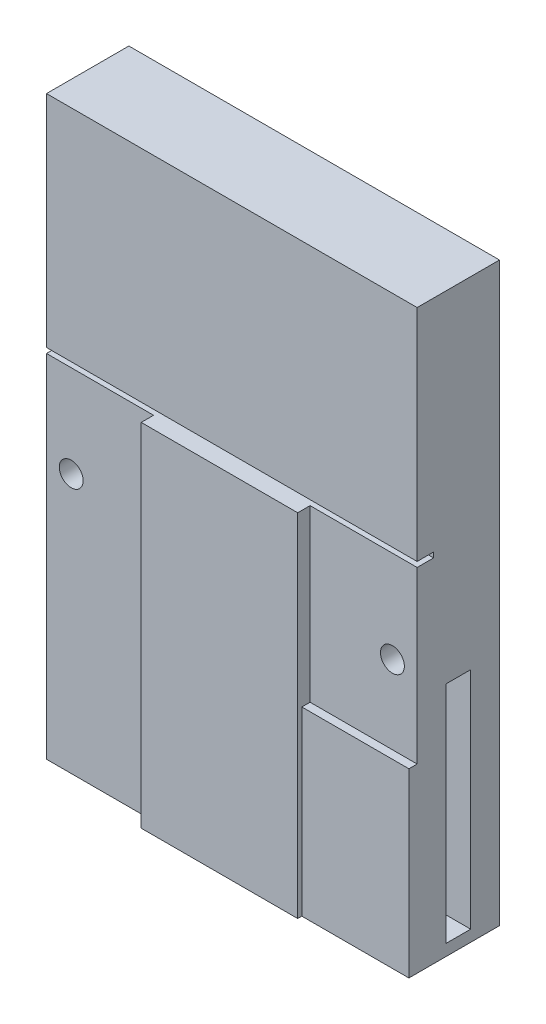
ISO-10303-21;
HEADER;
FILE_DESCRIPTION(('STEP AP214'),'2;1');
FILE_NAME('part.step','',(''),(''),'','','');
FILE_SCHEMA(('AUTOMOTIVE_DESIGN { 1 0 10303 214 1 1 1 1 }'));
ENDSEC;
DATA;
#1=APPLICATION_CONTEXT('core data for automotive mechanical design processes');
#2=APPLICATION_PROTOCOL_DEFINITION('international standard','automotive_design',2000,#1);
#3=PRODUCT_CONTEXT('',#1,'mechanical');
#4=PRODUCT('Part','Part','',(#3));
#5=PRODUCT_RELATED_PRODUCT_CATEGORY('part','',(#4));
#6=PRODUCT_DEFINITION_FORMATION('','',#4);
#7=PRODUCT_DEFINITION_CONTEXT('part definition',#1,'design');
#8=PRODUCT_DEFINITION('design','',#6,#7);
#9=PRODUCT_DEFINITION_SHAPE('','',#8);
#10=(LENGTH_UNIT() NAMED_UNIT(*) SI_UNIT(.MILLI.,.METRE.));
#11=(NAMED_UNIT(*) PLANE_ANGLE_UNIT() SI_UNIT($,.RADIAN.));
#12=(NAMED_UNIT(*) SI_UNIT($,.STERADIAN.) SOLID_ANGLE_UNIT());
#13=UNCERTAINTY_MEASURE_WITH_UNIT(LENGTH_MEASURE(1.E-05),#10,'distance_accuracy_value','');
#14=(GEOMETRIC_REPRESENTATION_CONTEXT(3) GLOBAL_UNCERTAINTY_ASSIGNED_CONTEXT((#13)) GLOBAL_UNIT_ASSIGNED_CONTEXT((#10,
#11,#12)) REPRESENTATION_CONTEXT('',''));
#15=CARTESIAN_POINT('',(0.,0.,0.));
#16=DIRECTION('',(0.,0.,1.));
#17=DIRECTION('',(1.,0.,0.));
#18=AXIS2_PLACEMENT_3D('',#15,#16,#17);
#19=CARTESIAN_POINT('',(22.5,40.,5.));
#20=DIRECTION('',(0.,0.,-1.));
#21=DIRECTION('',(-1.,0.,0.));
#22=AXIS2_PLACEMENT_3D('',#19,#20,#21);
#23=PLANE('',#22);
#24=CARTESIAN_POINT('',(19.5,11.5,5.));
#25=DIRECTION('',(0.,0.,1.));
#26=DIRECTION('',(1.,0.,0.));
#27=AXIS2_PLACEMENT_3D('',#24,#25,#26);
#28=CIRCLE('',#27,1.45);
#29=CARTESIAN_POINT('',(20.95,11.5,5.));
#30=VERTEX_POINT('',#29);
#31=EDGE_CURVE('E229',#30,#30,#28,.T.);
#32=ORIENTED_EDGE('',*,*,#31,.F.);
#33=EDGE_LOOP('',(#32));
#34=FACE_BOUND('',#33,.T.);
#35=DIRECTION('',(-1.,0.,0.));
#36=VECTOR('',#35,1.);
#37=CARTESIAN_POINT('',(9.5,2.,5.));
#38=LINE('',#37,#36);
#39=CARTESIAN_POINT('',(22.5,2.,5.));
#40=VERTEX_POINT('',#39);
#41=CARTESIAN_POINT('',(9.5,2.,5.));
#42=VERTEX_POINT('',#41);
#43=EDGE_CURVE('E188',#40,#42,#38,.T.);
#44=ORIENTED_EDGE('',*,*,#43,.F.);
#45=DIRECTION('',(0.,-1.,0.));
#46=VECTOR('',#45,1.);
#47=CARTESIAN_POINT('',(22.5,40.,5.));
#48=LINE('',#47,#46);
#49=CARTESIAN_POINT('',(22.5,22.6713275749144,5.));
#50=VERTEX_POINT('',#49);
#51=EDGE_CURVE('E258',#50,#40,#48,.T.);
#52=ORIENTED_EDGE('',*,*,#51,.F.);
#53=DIRECTION('',(1.,0.,0.));
#54=VECTOR('',#53,1.);
#55=CARTESIAN_POINT('',(-22.5,22.6713275749144,5.));
#56=LINE('',#55,#54);
#57=CARTESIAN_POINT('',(9.49999999999998,22.6713275749144,5.));
#58=VERTEX_POINT('',#57);
#59=EDGE_CURVE('E196',#58,#50,#56,.T.);
#60=ORIENTED_EDGE('',*,*,#59,.F.);
#61=DIRECTION('',(0.,1.,0.));
#62=VECTOR('',#61,1.);
#63=CARTESIAN_POINT('',(9.49999999999999,22.6713275749144,5.));
#64=LINE('',#63,#62);
#65=EDGE_CURVE('E316',#42,#58,#64,.T.);
#66=ORIENTED_EDGE('',*,*,#65,.F.);
#67=EDGE_LOOP('',(#44,#52,#60,#66));
#68=FACE_BOUND('',#67,.T.);
#69=ADVANCED_FACE('F41',(#34,#68),#23,.F.);
#70=CARTESIAN_POINT('',(9.49999999999999,22.6713275749144,6.5));
#71=DIRECTION('',(-1.,0.,0.));
#72=DIRECTION('',(0.,-1.,0.));
#73=AXIS2_PLACEMENT_3D('',#70,#71,#72);
#74=PLANE('',#73);
#75=DIRECTION('',(0.,0.,-1.));
#76=VECTOR('',#75,1.);
#77=CARTESIAN_POINT('',(9.5,2.,6.));
#78=LINE('',#77,#76);
#79=CARTESIAN_POINT('',(9.49999999999999,2.,6.));
#80=VERTEX_POINT('',#79);
#81=EDGE_CURVE('E58',#80,#42,#78,.T.);
#82=ORIENTED_EDGE('',*,*,#81,.T.);
#83=ORIENTED_EDGE('',*,*,#65,.T.);
#84=DIRECTION('',(0.,0.,-1.));
#85=VECTOR('',#84,1.);
#86=CARTESIAN_POINT('',(9.49999999999999,22.6713275749144,6.5));
#87=LINE('',#86,#85);
#88=CARTESIAN_POINT('',(9.49999999999999,22.6713275749144,6.5));
#89=VERTEX_POINT('',#88);
#90=EDGE_CURVE('E194',#89,#58,#87,.T.);
#91=ORIENTED_EDGE('',*,*,#90,.F.);
#92=DIRECTION('',(0.,1.,0.));
#93=VECTOR('',#92,1.);
#94=CARTESIAN_POINT('',(9.49999999999999,22.6713275749144,6.5));
#95=LINE('',#94,#93);
#96=CARTESIAN_POINT('',(9.5,-20.,6.5));
#97=VERTEX_POINT('',#96);
#98=EDGE_CURVE('E192',#97,#89,#95,.T.);
#99=ORIENTED_EDGE('',*,*,#98,.F.);
#100=DIRECTION('',(0.,0.,-1.));
#101=VECTOR('',#100,1.);
#102=CARTESIAN_POINT('',(9.5,-20.,6.5));
#103=LINE('',#102,#101);
#104=CARTESIAN_POINT('',(9.49999999999999,-20.,6.));
#105=VERTEX_POINT('',#104);
#106=EDGE_CURVE('E174',#97,#105,#103,.T.);
#107=ORIENTED_EDGE('',*,*,#106,.T.);
#108=DIRECTION('',(0.,-1.,0.));
#109=VECTOR('',#108,1.);
#110=CARTESIAN_POINT('',(9.5,2.,6.));
#111=LINE('',#110,#109);
#112=EDGE_CURVE('E182',#80,#105,#111,.T.);
#113=ORIENTED_EDGE('',*,*,#112,.F.);
#114=EDGE_LOOP('',(#82,#83,#91,#99,#107,#113));
#115=FACE_BOUND('',#114,.T.);
#116=ADVANCED_FACE('F190',(#115),#74,.F.);
#117=CARTESIAN_POINT('',(-19.5,11.5,5.));
#118=DIRECTION('',(0.,0.,1.));
#119=DIRECTION('',(1.,0.,0.));
#120=AXIS2_PLACEMENT_3D('',#117,#118,#119);
#121=CIRCLE('',#120,1.45);
#122=CARTESIAN_POINT('',(-18.05,11.5,5.));
#123=VERTEX_POINT('',#122);
#124=EDGE_CURVE('E222',#123,#123,#121,.T.);
#125=ORIENTED_EDGE('',*,*,#124,.F.);
#126=EDGE_LOOP('',(#125));
#127=FACE_BOUND('',#126,.T.);
#128=DIRECTION('',(0.,-1.,0.));
#129=VECTOR('',#128,1.);
#130=CARTESIAN_POINT('',(-9.50000000000001,22.6713275749144,5.));
#131=LINE('',#130,#129);
#132=CARTESIAN_POINT('',(-9.50000000000001,22.6713275749144,5.));
#133=VERTEX_POINT('',#132);
#134=CARTESIAN_POINT('',(-9.5,-20.,5.));
#135=VERTEX_POINT('',#134);
#136=EDGE_CURVE('E311',#133,#135,#131,.T.);
#137=ORIENTED_EDGE('',*,*,#136,.F.);
#138=CARTESIAN_POINT('',(-22.5,22.6713275749144,5.));
#139=VERTEX_POINT('',#138);
#140=EDGE_CURVE('E215',#139,#133,#56,.T.);
#141=ORIENTED_EDGE('',*,*,#140,.F.);
#142=DIRECTION('',(0.,-1.,0.));
#143=VECTOR('',#142,1.);
#144=CARTESIAN_POINT('',(-22.5,40.,5.00000000000001));
#145=LINE('',#144,#143);
#146=CARTESIAN_POINT('',(-22.5,-20.,5.00000000000001));
#147=VERTEX_POINT('',#146);
#148=EDGE_CURVE('E50',#139,#147,#145,.T.);
#149=ORIENTED_EDGE('',*,*,#148,.T.);
#150=DIRECTION('',(-1.,0.,0.));
#151=VECTOR('',#150,1.);
#152=CARTESIAN_POINT('',(-22.5,-20.,5.00000000000001));
#153=LINE('',#152,#151);
#154=EDGE_CURVE('E240',#135,#147,#153,.T.);
#155=ORIENTED_EDGE('',*,*,#154,.F.);
#156=EDGE_LOOP('',(#137,#141,#149,#155));
#157=FACE_BOUND('',#156,.T.);
#158=ADVANCED_FACE('F289',(#127,#157),#23,.F.);
#159=CARTESIAN_POINT('',(-22.5,50.,5.));
#160=VERTEX_POINT('',#159);
#161=CARTESIAN_POINT('',(-22.5,23.2974929319475,5.));
#162=VERTEX_POINT('',#161);
#163=EDGE_CURVE('E11',#160,#162,#145,.T.);
#164=ORIENTED_EDGE('',*,*,#163,.T.);
#165=DIRECTION('',(-1.,0.,0.));
#166=VECTOR('',#165,1.);
#167=CARTESIAN_POINT('',(-22.5,23.2974929319475,5.));
#168=LINE('',#167,#166);
#169=CARTESIAN_POINT('',(22.5,23.2974929319475,5.));
#170=VERTEX_POINT('',#169);
#171=EDGE_CURVE('E207',#170,#162,#168,.T.);
#172=ORIENTED_EDGE('',*,*,#171,.F.);
#173=CARTESIAN_POINT('',(22.5,50.,5.));
#174=VERTEX_POINT('',#173);
#175=EDGE_CURVE('E259',#174,#170,#48,.T.);
#176=ORIENTED_EDGE('',*,*,#175,.F.);
#177=DIRECTION('',(1.,0.,0.));
#178=VECTOR('',#177,1.);
#179=CARTESIAN_POINT('',(-22.5,50.,5.));
#180=LINE('',#179,#178);
#181=EDGE_CURVE('E245',#160,#174,#180,.T.);
#182=ORIENTED_EDGE('',*,*,#181,.F.);
#183=EDGE_LOOP('',(#164,#172,#176,#182));
#184=FACE_BOUND('',#183,.T.);
#185=ADVANCED_FACE('F288',(#184),#23,.F.);
#186=CARTESIAN_POINT('',(-22.5,40.,-4.99999999999999));
#187=DIRECTION('',(1.,0.,0.));
#188=DIRECTION('',(0.,0.,-1.));
#189=AXIS2_PLACEMENT_3D('',#186,#187,#188);
#190=PLANE('',#189);
#191=DIRECTION('',(0.,-1.,0.));
#192=VECTOR('',#191,1.);
#193=CARTESIAN_POINT('',(-22.5,23.2974929319475,3.));
#194=LINE('',#193,#192);
#195=CARTESIAN_POINT('',(-22.5,23.2974929319475,3.));
#196=VERTEX_POINT('',#195);
#197=CARTESIAN_POINT('',(-22.5,22.6713275749144,3.));
#198=VERTEX_POINT('',#197);
#199=EDGE_CURVE('E203',#196,#198,#194,.T.);
#200=ORIENTED_EDGE('',*,*,#199,.F.);
#201=DIRECTION('',(0.,0.,1.));
#202=VECTOR('',#201,1.);
#203=CARTESIAN_POINT('',(-22.5,23.2974929319475,3.));
#204=LINE('',#203,#202);
#205=EDGE_CURVE('E219',#196,#162,#204,.T.);
#206=ORIENTED_EDGE('',*,*,#205,.T.);
#207=ORIENTED_EDGE('',*,*,#163,.F.);
#208=DIRECTION('',(0.,0.,1.));
#209=VECTOR('',#208,1.);
#210=CARTESIAN_POINT('',(-22.5,50.,-4.99999999999999));
#211=LINE('',#210,#209);
#212=CARTESIAN_POINT('',(-22.5,50.,-4.99999999999999));
#213=VERTEX_POINT('',#212);
#214=EDGE_CURVE('E242',#213,#160,#211,.T.);
#215=ORIENTED_EDGE('',*,*,#214,.F.);
#216=DIRECTION('',(0.,-1.,0.));
#217=VECTOR('',#216,1.);
#218=CARTESIAN_POINT('',(-22.5,40.,-4.99999999999999));
#219=LINE('',#218,#217);
#220=CARTESIAN_POINT('',(-22.5,-20.,-5.));
#221=VERTEX_POINT('',#220);
#222=EDGE_CURVE('E254',#213,#221,#219,.T.);
#223=ORIENTED_EDGE('',*,*,#222,.T.);
#224=DIRECTION('',(0.,0.,-1.));
#225=VECTOR('',#224,1.);
#226=CARTESIAN_POINT('',(-22.5,-20.,5.00000000000001));
#227=LINE('',#226,#225);
#228=EDGE_CURVE('E235',#147,#221,#227,.T.);
#229=ORIENTED_EDGE('',*,*,#228,.F.);
#230=ORIENTED_EDGE('',*,*,#148,.F.);
#231=DIRECTION('',(0.,0.,1.));
#232=VECTOR('',#231,1.);
#233=CARTESIAN_POINT('',(-22.5,22.6713275749144,3.));
#234=LINE('',#233,#232);
#235=EDGE_CURVE('E214',#198,#139,#234,.T.);
#236=ORIENTED_EDGE('',*,*,#235,.F.);
#237=EDGE_LOOP('',(#200,#206,#207,#215,#223,#229,#230,#236));
#238=FACE_BOUND('',#237,.T.);
#239=ADVANCED_FACE('F43',(#238),#190,.F.);
#240=CARTESIAN_POINT('',(22.5,40.,-5.));
#241=DIRECTION('',(-1.,0.,0.));
#242=DIRECTION('',(0.,0.,1.));
#243=AXIS2_PLACEMENT_3D('',#240,#241,#242);
#244=PLANE('',#243);
#245=DIRECTION('',(0.,0.,-1.));
#246=VECTOR('',#245,1.);
#247=CARTESIAN_POINT('',(22.5,-18.6150080325972,1.5));
#248=LINE('',#247,#246);
#249=CARTESIAN_POINT('',(22.5,-18.6150080325973,1.5));
#250=VERTEX_POINT('',#249);
#251=CARTESIAN_POINT('',(22.5,-18.6150080325972,-1.5));
#252=VERTEX_POINT('',#251);
#253=EDGE_CURVE('E386',#250,#252,#248,.T.);
#254=ORIENTED_EDGE('',*,*,#253,.F.);
#255=DIRECTION('',(0.,-1.,0.));
#256=VECTOR('',#255,1.);
#257=CARTESIAN_POINT('',(22.5,8.67132757491439,1.5));
#258=LINE('',#257,#256);
#259=CARTESIAN_POINT('',(22.5,8.67132757491439,1.5));
#260=VERTEX_POINT('',#259);
#261=EDGE_CURVE('E66',#260,#250,#258,.T.);
#262=ORIENTED_EDGE('',*,*,#261,.F.);
#263=DIRECTION('',(0.,0.,1.));
#264=VECTOR('',#263,1.);
#265=CARTESIAN_POINT('',(22.5,8.67132757491439,1.5));
#266=LINE('',#265,#264);
#267=CARTESIAN_POINT('',(22.5,8.67132757491439,-1.5));
#268=VERTEX_POINT('',#267);
#269=EDGE_CURVE('E376',#268,#260,#266,.T.);
#270=ORIENTED_EDGE('',*,*,#269,.F.);
#271=DIRECTION('',(0.,1.,0.));
#272=VECTOR('',#271,1.);
#273=CARTESIAN_POINT('',(22.5,8.67132757491439,-1.5));
#274=LINE('',#273,#272);
#275=EDGE_CURVE('E389',#252,#268,#274,.T.);
#276=ORIENTED_EDGE('',*,*,#275,.F.);
#277=EDGE_LOOP('',(#254,#262,#270,#276));
#278=FACE_BOUND('',#277,.T.);
#279=ORIENTED_EDGE('',*,*,#175,.T.);
#280=DIRECTION('',(0.,0.,1.));
#281=VECTOR('',#280,1.);
#282=CARTESIAN_POINT('',(22.5,23.2974929319475,3.));
#283=LINE('',#282,#281);
#284=CARTESIAN_POINT('',(22.5,23.2974929319475,3.));
#285=VERTEX_POINT('',#284);
#286=EDGE_CURVE('E223',#285,#170,#283,.T.);
#287=ORIENTED_EDGE('',*,*,#286,.F.);
#288=DIRECTION('',(0.,1.,0.));
#289=VECTOR('',#288,1.);
#290=CARTESIAN_POINT('',(22.5,23.2974929319475,3.));
#291=LINE('',#290,#289);
#292=CARTESIAN_POINT('',(22.5,22.6713275749144,3.));
#293=VERTEX_POINT('',#292);
#294=EDGE_CURVE('E209',#293,#285,#291,.T.);
#295=ORIENTED_EDGE('',*,*,#294,.F.);
#296=DIRECTION('',(0.,0.,1.));
#297=VECTOR('',#296,1.);
#298=CARTESIAN_POINT('',(22.5,22.6713275749144,3.));
#299=LINE('',#298,#297);
#300=EDGE_CURVE('E225',#293,#50,#299,.T.);
#301=ORIENTED_EDGE('',*,*,#300,.T.);
#302=ORIENTED_EDGE('',*,*,#51,.T.);
#303=DIRECTION('',(0.,0.,-1.));
#304=VECTOR('',#303,1.);
#305=CARTESIAN_POINT('',(22.5,2.,6.));
#306=LINE('',#305,#304);
#307=CARTESIAN_POINT('',(22.5,2.,6.));
#308=VERTEX_POINT('',#307);
#309=EDGE_CURVE('E353',#308,#40,#306,.T.);
#310=ORIENTED_EDGE('',*,*,#309,.F.);
#311=DIRECTION('',(0.,1.,0.));
#312=VECTOR('',#311,1.);
#313=CARTESIAN_POINT('',(22.5,2.,6.));
#314=LINE('',#313,#312);
#315=CARTESIAN_POINT('',(22.5,-20.,6.));
#316=VERTEX_POINT('',#315);
#317=EDGE_CURVE('E181',#316,#308,#314,.T.);
#318=ORIENTED_EDGE('',*,*,#317,.F.);
#319=DIRECTION('',(0.,0.,1.));
#320=VECTOR('',#319,1.);
#321=CARTESIAN_POINT('',(22.5,-20.,5.00000000000001));
#322=LINE('',#321,#320);
#323=CARTESIAN_POINT('',(22.5,-20.,-5.));
#324=VERTEX_POINT('',#323);
#325=EDGE_CURVE('E178',#324,#316,#322,.T.);
#326=ORIENTED_EDGE('',*,*,#325,.F.);
#327=DIRECTION('',(0.,-1.,0.));
#328=VECTOR('',#327,1.);
#329=CARTESIAN_POINT('',(22.5,40.,-5.));
#330=LINE('',#329,#328);
#331=CARTESIAN_POINT('',(22.5,50.,-4.99999999999999));
#332=VERTEX_POINT('',#331);
#333=EDGE_CURVE('E256',#332,#324,#330,.T.);
#334=ORIENTED_EDGE('',*,*,#333,.F.);
#335=DIRECTION('',(0.,0.,-1.));
#336=VECTOR('',#335,1.);
#337=CARTESIAN_POINT('',(22.5,50.,-4.99999999999999));
#338=LINE('',#337,#336);
#339=EDGE_CURVE('E248',#174,#332,#338,.T.);
#340=ORIENTED_EDGE('',*,*,#339,.F.);
#341=EDGE_LOOP('',(#279,#287,#295,#301,#302,#310,#318,#326,#334,#340));
#342=FACE_BOUND('',#341,.T.);
#343=ADVANCED_FACE('F352',(#278,#342),#244,.F.);
#344=CARTESIAN_POINT('',(22.5,40.,-5.));
#345=DIRECTION('',(0.,0.,1.));
#346=DIRECTION('',(1.,0.,0.));
#347=AXIS2_PLACEMENT_3D('',#344,#345,#346);
#348=PLANE('',#347);
#349=CARTESIAN_POINT('',(19.5,11.5,-5.));
#350=DIRECTION('',(0.,0.,1.));
#351=DIRECTION('',(1.,0.,0.));
#352=AXIS2_PLACEMENT_3D('',#349,#350,#351);
#353=CIRCLE('',#352,1.45);
#354=CARTESIAN_POINT('',(20.95,11.5,-5.));
#355=VERTEX_POINT('',#354);
#356=EDGE_CURVE('E45',#355,#355,#353,.T.);
#357=ORIENTED_EDGE('',*,*,#356,.T.);
#358=EDGE_LOOP('',(#357));
#359=FACE_BOUND('',#358,.T.);
#360=CARTESIAN_POINT('',(-19.5,11.5,-4.99999999999999));
#361=DIRECTION('',(0.,0.,1.));
#362=DIRECTION('',(1.,0.,0.));
#363=AXIS2_PLACEMENT_3D('',#360,#361,#362);
#364=CIRCLE('',#363,1.45);
#365=CARTESIAN_POINT('',(-18.05,11.5,-4.99999999999999));
#366=VERTEX_POINT('',#365);
#367=EDGE_CURVE('E232',#366,#366,#364,.T.);
#368=ORIENTED_EDGE('',*,*,#367,.T.);
#369=EDGE_LOOP('',(#368));
#370=FACE_BOUND('',#369,.T.);
#371=ORIENTED_EDGE('',*,*,#333,.T.);
#372=DIRECTION('',(1.,0.,0.));
#373=VECTOR('',#372,1.);
#374=CARTESIAN_POINT('',(-22.5,-20.,-5.));
#375=LINE('',#374,#373);
#376=EDGE_CURVE('E237',#221,#324,#375,.T.);
#377=ORIENTED_EDGE('',*,*,#376,.F.);
#378=ORIENTED_EDGE('',*,*,#222,.F.);
#379=DIRECTION('',(-1.,0.,0.));
#380=VECTOR('',#379,1.);
#381=CARTESIAN_POINT('',(-22.5,50.,-4.99999999999999));
#382=LINE('',#381,#380);
#383=EDGE_CURVE('E251',#332,#213,#382,.T.);
#384=ORIENTED_EDGE('',*,*,#383,.F.);
#385=EDGE_LOOP('',(#371,#377,#378,#384));
#386=FACE_BOUND('',#385,.T.);
#387=ADVANCED_FACE('F267',(#359,#370,#386),#348,.F.);
#388=CARTESIAN_POINT('',(0.,50.,0.));
#389=DIRECTION('',(0.,1.,0.));
#390=DIRECTION('',(0.,0.,1.));
#391=AXIS2_PLACEMENT_3D('',#388,#389,#390);
#392=PLANE('',#391);
#393=ORIENTED_EDGE('',*,*,#214,.T.);
#394=ORIENTED_EDGE('',*,*,#181,.T.);
#395=ORIENTED_EDGE('',*,*,#339,.T.);
#396=ORIENTED_EDGE('',*,*,#383,.T.);
#397=EDGE_LOOP('',(#393,#394,#395,#396));
#398=FACE_BOUND('',#397,.T.);
#399=ADVANCED_FACE('F363',(#398),#392,.T.);
#400=CARTESIAN_POINT('',(0.,-20.,0.));
#401=DIRECTION('',(0.,-1.,0.));
#402=DIRECTION('',(0.,0.,-1.));
#403=AXIS2_PLACEMENT_3D('',#400,#401,#402);
#404=PLANE('',#403);
#405=ORIENTED_EDGE('',*,*,#228,.T.);
#406=ORIENTED_EDGE('',*,*,#376,.T.);
#407=ORIENTED_EDGE('',*,*,#325,.T.);
#408=DIRECTION('',(1.,0.,0.));
#409=VECTOR('',#408,1.);
#410=CARTESIAN_POINT('',(9.49999999999999,-20.,6.));
#411=LINE('',#410,#409);
#412=EDGE_CURVE('E169',#105,#316,#411,.T.);
#413=ORIENTED_EDGE('',*,*,#412,.F.);
#414=ORIENTED_EDGE('',*,*,#106,.F.);
#415=DIRECTION('',(1.,0.,0.));
#416=VECTOR('',#415,1.);
#417=CARTESIAN_POINT('',(-9.5,-20.,6.5));
#418=LINE('',#417,#416);
#419=CARTESIAN_POINT('',(-9.5,-20.,6.5));
#420=VERTEX_POINT('',#419);
#421=EDGE_CURVE('E330',#420,#97,#418,.T.);
#422=ORIENTED_EDGE('',*,*,#421,.F.);
#423=DIRECTION('',(0.,0.,-1.));
#424=VECTOR('',#423,1.);
#425=CARTESIAN_POINT('',(-9.5,-20.,6.5));
#426=LINE('',#425,#424);
#427=EDGE_CURVE('E193',#420,#135,#426,.T.);
#428=ORIENTED_EDGE('',*,*,#427,.T.);
#429=ORIENTED_EDGE('',*,*,#154,.T.);
#430=EDGE_LOOP('',(#405,#406,#407,#413,#414,#422,#428,#429));
#431=FACE_BOUND('',#430,.T.);
#432=ADVANCED_FACE('F172',(#431),#404,.T.);
#433=CARTESIAN_POINT('',(-19.5,11.5,-15.));
#434=DIRECTION('',(0.,0.,1.));
#435=DIRECTION('',(1.,0.,0.));
#436=AXIS2_PLACEMENT_3D('',#433,#434,#435);
#437=CYLINDRICAL_SURFACE('',#436,1.45);
#438=ORIENTED_EDGE('',*,*,#124,.T.);
#439=EDGE_LOOP('',(#438));
#440=FACE_BOUND('',#439,.T.);
#441=ORIENTED_EDGE('',*,*,#367,.F.);
#442=EDGE_LOOP('',(#441));
#443=FACE_BOUND('',#442,.T.);
#444=ADVANCED_FACE('F272',(#440,#443),#437,.F.);
#445=CARTESIAN_POINT('',(19.5,11.5,-15.));
#446=DIRECTION('',(0.,0.,1.));
#447=DIRECTION('',(1.,0.,0.));
#448=AXIS2_PLACEMENT_3D('',#445,#446,#447);
#449=CYLINDRICAL_SURFACE('',#448,1.45);
#450=ORIENTED_EDGE('',*,*,#31,.T.);
#451=EDGE_LOOP('',(#450));
#452=FACE_BOUND('',#451,.T.);
#453=ORIENTED_EDGE('',*,*,#356,.F.);
#454=EDGE_LOOP('',(#453));
#455=FACE_BOUND('',#454,.T.);
#456=ADVANCED_FACE('F269',(#452,#455),#449,.F.);
#457=CARTESIAN_POINT('',(-22.5,23.2974929319475,3.));
#458=DIRECTION('',(0.,1.,0.));
#459=DIRECTION('',(0.,0.,1.));
#460=AXIS2_PLACEMENT_3D('',#457,#458,#459);
#461=PLANE('',#460);
#462=ORIENTED_EDGE('',*,*,#171,.T.);
#463=ORIENTED_EDGE('',*,*,#205,.F.);
#464=DIRECTION('',(-1.,0.,0.));
#465=VECTOR('',#464,1.);
#466=CARTESIAN_POINT('',(-22.5,23.2974929319475,3.));
#467=LINE('',#466,#465);
#468=EDGE_CURVE('E211',#285,#196,#467,.T.);
#469=ORIENTED_EDGE('',*,*,#468,.F.);
#470=ORIENTED_EDGE('',*,*,#286,.T.);
#471=EDGE_LOOP('',(#462,#463,#469,#470));
#472=FACE_BOUND('',#471,.T.);
#473=ADVANCED_FACE('F271',(#472),#461,.F.);
#474=CARTESIAN_POINT('',(-22.5,22.6713275749144,3.));
#475=DIRECTION('',(0.,-1.,0.));
#476=DIRECTION('',(0.,0.,-1.));
#477=AXIS2_PLACEMENT_3D('',#474,#475,#476);
#478=PLANE('',#477);
#479=ORIENTED_EDGE('',*,*,#140,.T.);
#480=DIRECTION('',(0.,0.,-1.));
#481=VECTOR('',#480,1.);
#482=CARTESIAN_POINT('',(-9.50000000000001,22.6713275749144,6.5));
#483=LINE('',#482,#481);
#484=CARTESIAN_POINT('',(-9.50000000000001,22.6713275749144,6.5));
#485=VERTEX_POINT('',#484);
#486=EDGE_CURVE('E199',#485,#133,#483,.T.);
#487=ORIENTED_EDGE('',*,*,#486,.F.);
#488=DIRECTION('',(-1.,0.,0.));
#489=VECTOR('',#488,1.);
#490=CARTESIAN_POINT('',(-9.50000000000001,22.6713275749144,6.5));
#491=LINE('',#490,#489);
#492=EDGE_CURVE('E343',#89,#485,#491,.T.);
#493=ORIENTED_EDGE('',*,*,#492,.F.);
#494=ORIENTED_EDGE('',*,*,#90,.T.);
#495=ORIENTED_EDGE('',*,*,#59,.T.);
#496=ORIENTED_EDGE('',*,*,#300,.F.);
#497=DIRECTION('',(1.,0.,0.));
#498=VECTOR('',#497,1.);
#499=CARTESIAN_POINT('',(-22.5,22.6713275749144,3.));
#500=LINE('',#499,#498);
#501=EDGE_CURVE('E206',#198,#293,#500,.T.);
#502=ORIENTED_EDGE('',*,*,#501,.F.);
#503=ORIENTED_EDGE('',*,*,#235,.T.);
#504=EDGE_LOOP('',(#479,#487,#493,#494,#495,#496,#502,#503));
#505=FACE_BOUND('',#504,.T.);
#506=ADVANCED_FACE('F280',(#505),#478,.F.);
#507=CARTESIAN_POINT('',(0.,0.,3.));
#508=DIRECTION('',(0.,0.,1.));
#509=DIRECTION('',(1.,0.,0.));
#510=AXIS2_PLACEMENT_3D('',#507,#508,#509);
#511=PLANE('',#510);
#512=ORIENTED_EDGE('',*,*,#199,.T.);
#513=ORIENTED_EDGE('',*,*,#501,.T.);
#514=ORIENTED_EDGE('',*,*,#294,.T.);
#515=ORIENTED_EDGE('',*,*,#468,.T.);
#516=EDGE_LOOP('',(#512,#513,#514,#515));
#517=FACE_BOUND('',#516,.T.);
#518=ADVANCED_FACE('F358',(#517),#511,.T.);
#519=CARTESIAN_POINT('',(-9.50000000000001,22.6713275749144,6.5));
#520=DIRECTION('',(1.,0.,0.));
#521=DIRECTION('',(0.,1.,0.));
#522=AXIS2_PLACEMENT_3D('',#519,#520,#521);
#523=PLANE('',#522);
#524=ORIENTED_EDGE('',*,*,#136,.T.);
#525=ORIENTED_EDGE('',*,*,#427,.F.);
#526=DIRECTION('',(0.,-1.,0.));
#527=VECTOR('',#526,1.);
#528=CARTESIAN_POINT('',(-9.50000000000001,22.6713275749144,6.5));
#529=LINE('',#528,#527);
#530=EDGE_CURVE('E333',#485,#420,#529,.T.);
#531=ORIENTED_EDGE('',*,*,#530,.F.);
#532=ORIENTED_EDGE('',*,*,#486,.T.);
#533=EDGE_LOOP('',(#524,#525,#531,#532));
#534=FACE_BOUND('',#533,.T.);
#535=ADVANCED_FACE('F332',(#534),#523,.F.);
#536=CARTESIAN_POINT('',(0.,0.,6.5));
#537=DIRECTION('',(0.,0.,1.));
#538=DIRECTION('',(1.,0.,0.));
#539=AXIS2_PLACEMENT_3D('',#536,#537,#538);
#540=PLANE('',#539);
#541=ORIENTED_EDGE('',*,*,#530,.T.);
#542=ORIENTED_EDGE('',*,*,#421,.T.);
#543=ORIENTED_EDGE('',*,*,#98,.T.);
#544=ORIENTED_EDGE('',*,*,#492,.T.);
#545=EDGE_LOOP('',(#541,#542,#543,#544));
#546=FACE_BOUND('',#545,.T.);
#547=ADVANCED_FACE('F344',(#546),#540,.T.);
#548=CARTESIAN_POINT('',(12.5,8.67132757491439,1.5));
#549=DIRECTION('',(0.,0.,1.));
#550=DIRECTION('',(1.,0.,0.));
#551=AXIS2_PLACEMENT_3D('',#548,#549,#550);
#552=PLANE('',#551);
#553=ORIENTED_EDGE('',*,*,#261,.T.);
#554=DIRECTION('',(1.,0.,0.));
#555=VECTOR('',#554,1.);
#556=CARTESIAN_POINT('',(12.5,-18.6150080325972,1.5));
#557=LINE('',#556,#555);
#558=CARTESIAN_POINT('',(12.5,-18.6150080325972,1.5));
#559=VERTEX_POINT('',#558);
#560=EDGE_CURVE('E339',#559,#250,#557,.T.);
#561=ORIENTED_EDGE('',*,*,#560,.F.);
#562=DIRECTION('',(0.,-1.,0.));
#563=VECTOR('',#562,1.);
#564=CARTESIAN_POINT('',(12.5,8.67132757491439,1.5));
#565=LINE('',#564,#563);
#566=CARTESIAN_POINT('',(12.5,8.67132757491439,1.5));
#567=VERTEX_POINT('',#566);
#568=EDGE_CURVE('E372',#567,#559,#565,.T.);
#569=ORIENTED_EDGE('',*,*,#568,.F.);
#570=DIRECTION('',(1.,0.,0.));
#571=VECTOR('',#570,1.);
#572=CARTESIAN_POINT('',(12.5,8.67132757491439,1.5));
#573=LINE('',#572,#571);
#574=EDGE_CURVE('E317',#567,#260,#573,.T.);
#575=ORIENTED_EDGE('',*,*,#574,.T.);
#576=EDGE_LOOP('',(#553,#561,#569,#575));
#577=FACE_BOUND('',#576,.T.);
#578=ADVANCED_FACE('F413',(#577),#552,.F.);
#579=CARTESIAN_POINT('',(12.5,8.67132757491439,1.5));
#580=DIRECTION('',(0.,1.,0.));
#581=DIRECTION('',(0.,0.,1.));
#582=AXIS2_PLACEMENT_3D('',#579,#580,#581);
#583=PLANE('',#582);
#584=ORIENTED_EDGE('',*,*,#269,.T.);
#585=ORIENTED_EDGE('',*,*,#574,.F.);
#586=DIRECTION('',(0.,0.,1.));
#587=VECTOR('',#586,1.);
#588=CARTESIAN_POINT('',(12.5,8.67132757491439,1.5));
#589=LINE('',#588,#587);
#590=CARTESIAN_POINT('',(12.5,8.67132757491439,-1.5));
#591=VERTEX_POINT('',#590);
#592=EDGE_CURVE('E382',#591,#567,#589,.T.);
#593=ORIENTED_EDGE('',*,*,#592,.F.);
#594=DIRECTION('',(1.,0.,0.));
#595=VECTOR('',#594,1.);
#596=CARTESIAN_POINT('',(12.5,8.67132757491439,-1.5));
#597=LINE('',#596,#595);
#598=EDGE_CURVE('E395',#591,#268,#597,.T.);
#599=ORIENTED_EDGE('',*,*,#598,.T.);
#600=EDGE_LOOP('',(#584,#585,#593,#599));
#601=FACE_BOUND('',#600,.T.);
#602=ADVANCED_FACE('F412',(#601),#583,.F.);
#603=CARTESIAN_POINT('',(12.5,8.67132757491439,-1.5));
#604=DIRECTION('',(0.,0.,-1.));
#605=DIRECTION('',(-1.,0.,0.));
#606=AXIS2_PLACEMENT_3D('',#603,#604,#605);
#607=PLANE('',#606);
#608=ORIENTED_EDGE('',*,*,#275,.T.);
#609=ORIENTED_EDGE('',*,*,#598,.F.);
#610=DIRECTION('',(0.,1.,0.));
#611=VECTOR('',#610,1.);
#612=CARTESIAN_POINT('',(12.5,8.67132757491439,-1.5));
#613=LINE('',#612,#611);
#614=CARTESIAN_POINT('',(12.5,-18.6150080325972,-1.5));
#615=VERTEX_POINT('',#614);
#616=EDGE_CURVE('E379',#615,#591,#613,.T.);
#617=ORIENTED_EDGE('',*,*,#616,.F.);
#618=DIRECTION('',(1.,0.,0.));
#619=VECTOR('',#618,1.);
#620=CARTESIAN_POINT('',(12.5,-18.6150080325972,-1.5));
#621=LINE('',#620,#619);
#622=EDGE_CURVE('E396',#615,#252,#621,.T.);
#623=ORIENTED_EDGE('',*,*,#622,.T.);
#624=EDGE_LOOP('',(#608,#609,#617,#623));
#625=FACE_BOUND('',#624,.T.);
#626=ADVANCED_FACE('F407',(#625),#607,.F.);
#627=CARTESIAN_POINT('',(12.5,-18.6150080325972,1.5));
#628=DIRECTION('',(0.,-1.,0.));
#629=DIRECTION('',(0.,0.,-1.));
#630=AXIS2_PLACEMENT_3D('',#627,#628,#629);
#631=PLANE('',#630);
#632=ORIENTED_EDGE('',*,*,#253,.T.);
#633=ORIENTED_EDGE('',*,*,#622,.F.);
#634=DIRECTION('',(0.,0.,-1.));
#635=VECTOR('',#634,1.);
#636=CARTESIAN_POINT('',(12.5,-18.6150080325972,1.5));
#637=LINE('',#636,#635);
#638=EDGE_CURVE('E375',#559,#615,#637,.T.);
#639=ORIENTED_EDGE('',*,*,#638,.F.);
#640=ORIENTED_EDGE('',*,*,#560,.T.);
#641=EDGE_LOOP('',(#632,#633,#639,#640));
#642=FACE_BOUND('',#641,.T.);
#643=ADVANCED_FACE('F402',(#642),#631,.F.);
#644=CARTESIAN_POINT('',(12.5,0.,0.));
#645=DIRECTION('',(1.,0.,0.));
#646=DIRECTION('',(0.,0.,-1.));
#647=AXIS2_PLACEMENT_3D('',#644,#645,#646);
#648=PLANE('',#647);
#649=ORIENTED_EDGE('',*,*,#568,.T.);
#650=ORIENTED_EDGE('',*,*,#638,.T.);
#651=ORIENTED_EDGE('',*,*,#616,.T.);
#652=ORIENTED_EDGE('',*,*,#592,.T.);
#653=EDGE_LOOP('',(#649,#650,#651,#652));
#654=FACE_BOUND('',#653,.T.);
#655=ADVANCED_FACE('F411',(#654),#648,.T.);
#656=CARTESIAN_POINT('',(9.5,2.,6.));
#657=DIRECTION('',(0.,-1.,0.));
#658=DIRECTION('',(0.,0.,-1.));
#659=AXIS2_PLACEMENT_3D('',#656,#657,#658);
#660=PLANE('',#659);
#661=ORIENTED_EDGE('',*,*,#43,.T.);
#662=ORIENTED_EDGE('',*,*,#81,.F.);
#663=DIRECTION('',(-1.,0.,0.));
#664=VECTOR('',#663,1.);
#665=CARTESIAN_POINT('',(9.5,2.,6.));
#666=LINE('',#665,#664);
#667=EDGE_CURVE('E186',#308,#80,#666,.T.);
#668=ORIENTED_EDGE('',*,*,#667,.F.);
#669=ORIENTED_EDGE('',*,*,#309,.T.);
#670=EDGE_LOOP('',(#661,#662,#668,#669));
#671=FACE_BOUND('',#670,.T.);
#672=ADVANCED_FACE('F473',(#671),#660,.F.);
#673=CARTESIAN_POINT('',(0.,0.,6.));
#674=DIRECTION('',(0.,0.,1.));
#675=DIRECTION('',(1.,0.,0.));
#676=AXIS2_PLACEMENT_3D('',#673,#674,#675);
#677=PLANE('',#676);
#678=ORIENTED_EDGE('',*,*,#112,.T.);
#679=ORIENTED_EDGE('',*,*,#412,.T.);
#680=ORIENTED_EDGE('',*,*,#317,.T.);
#681=ORIENTED_EDGE('',*,*,#667,.T.);
#682=EDGE_LOOP('',(#678,#679,#680,#681));
#683=FACE_BOUND('',#682,.T.);
#684=ADVANCED_FACE('F185',(#683),#677,.T.);
#685=CLOSED_SHELL('',(#69,#116,#158,#185,#239,#343,#387,#399,#432,#444,#456,#473,#506,#518,#535,
#547,#578,#602,#626,#643,#655,#672,#684));
#686=MANIFOLD_SOLID_BREP('B2',#685);
#687=ADVANCED_BREP_SHAPE_REPRESENTATION('',(#18,#686),#14);
#688=SHAPE_DEFINITION_REPRESENTATION(#9,#687);
ENDSEC;
END-ISO-10303-21;
